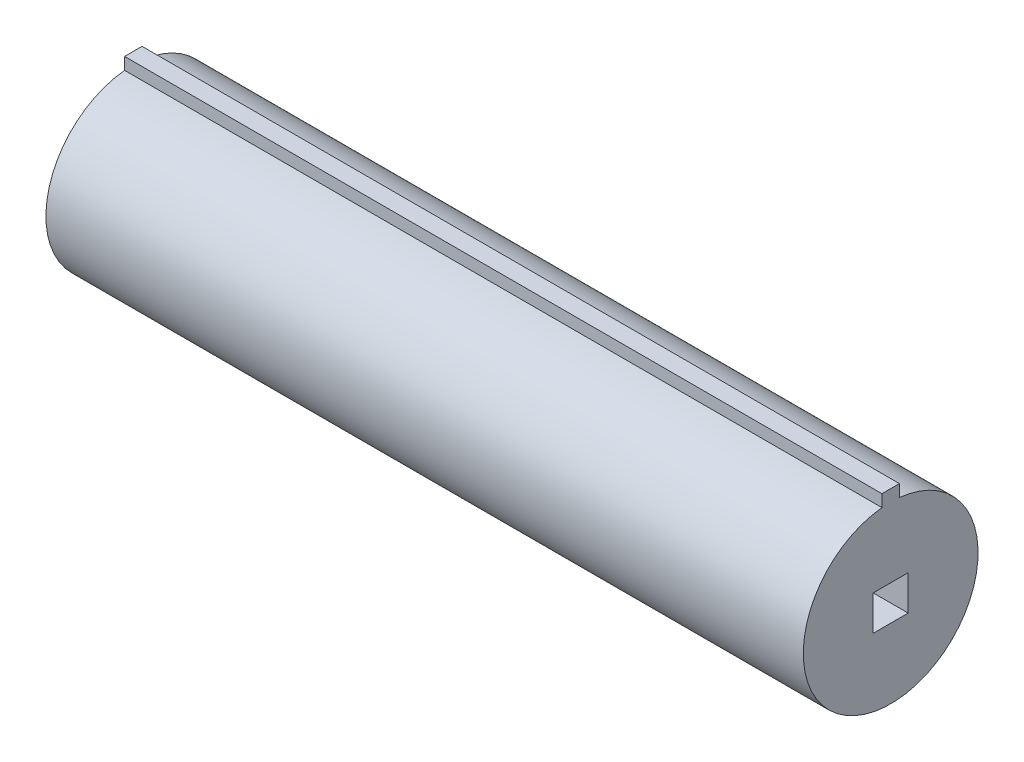
ISO-10303-21;
HEADER;
FILE_DESCRIPTION(('STEP AP214'),'2;1');
FILE_NAME('part.step','',(''),(''),'','','');
FILE_SCHEMA(('AUTOMOTIVE_DESIGN { 1 0 10303 214 1 1 1 1 }'));
ENDSEC;
DATA;
#1=APPLICATION_CONTEXT('core data for automotive mechanical design processes');
#2=APPLICATION_PROTOCOL_DEFINITION('international standard','automotive_design',2000,#1);
#3=PRODUCT_CONTEXT('',#1,'mechanical');
#4=PRODUCT('Part','Part','',(#3));
#5=PRODUCT_RELATED_PRODUCT_CATEGORY('part','',(#4));
#6=PRODUCT_DEFINITION_FORMATION('','',#4);
#7=PRODUCT_DEFINITION_CONTEXT('part definition',#1,'design');
#8=PRODUCT_DEFINITION('design','',#6,#7);
#9=PRODUCT_DEFINITION_SHAPE('','',#8);
#10=(LENGTH_UNIT() NAMED_UNIT(*) SI_UNIT(.MILLI.,.METRE.));
#11=(NAMED_UNIT(*) PLANE_ANGLE_UNIT() SI_UNIT($,.RADIAN.));
#12=(NAMED_UNIT(*) SI_UNIT($,.STERADIAN.) SOLID_ANGLE_UNIT());
#13=UNCERTAINTY_MEASURE_WITH_UNIT(LENGTH_MEASURE(1.E-05),#10,'distance_accuracy_value','');
#14=(GEOMETRIC_REPRESENTATION_CONTEXT(3) GLOBAL_UNCERTAINTY_ASSIGNED_CONTEXT((#13)) GLOBAL_UNIT_ASSIGNED_CONTEXT((#10,
#11,#12)) REPRESENTATION_CONTEXT('',''));
#15=CARTESIAN_POINT('',(0.,0.,0.));
#16=DIRECTION('',(0.,0.,1.));
#17=DIRECTION('',(1.,0.,0.));
#18=AXIS2_PLACEMENT_3D('',#15,#16,#17);
#19=CARTESIAN_POINT('',(130.,0.,0.));
#20=DIRECTION('',(-1.,0.,0.));
#21=DIRECTION('',(0.,0.,1.));
#22=AXIS2_PLACEMENT_3D('',#19,#20,#21);
#23=CYLINDRICAL_SURFACE('',#22,15.);
#24=CARTESIAN_POINT('',(0.,0.,0.));
#25=DIRECTION('',(1.,0.,0.));
#26=DIRECTION('',(0.,0.,-1.));
#27=AXIS2_PLACEMENT_3D('',#24,#25,#26);
#28=CIRCLE('',#27,15.);
#29=CARTESIAN_POINT('',(0.,14.9248115565993,1.5));
#30=VERTEX_POINT('',#29);
#31=CARTESIAN_POINT('',(0.,14.9248115565993,-1.5));
#32=VERTEX_POINT('',#31);
#33=EDGE_CURVE('E164',#30,#32,#28,.T.);
#34=ORIENTED_EDGE('',*,*,#33,.T.);
#35=DIRECTION('',(-1.,0.,0.));
#36=VECTOR('',#35,1.);
#37=CARTESIAN_POINT('',(130.,14.9248115565993,-1.5));
#38=LINE('',#37,#36);
#39=CARTESIAN_POINT('',(130.,14.9248115565993,-1.5));
#40=VERTEX_POINT('',#39);
#41=EDGE_CURVE('E11',#40,#32,#38,.T.);
#42=ORIENTED_EDGE('',*,*,#41,.F.);
#43=CARTESIAN_POINT('',(130.,0.,0.));
#44=DIRECTION('',(1.,0.,0.));
#45=DIRECTION('',(0.,0.,-1.));
#46=AXIS2_PLACEMENT_3D('',#43,#44,#45);
#47=CIRCLE('',#46,15.);
#48=CARTESIAN_POINT('',(130.,14.9248115565993,1.5));
#49=VERTEX_POINT('',#48);
#50=EDGE_CURVE('E170',#49,#40,#47,.T.);
#51=ORIENTED_EDGE('',*,*,#50,.F.);
#52=DIRECTION('',(-1.,0.,0.));
#53=VECTOR('',#52,1.);
#54=CARTESIAN_POINT('',(130.,14.9248115565993,1.5));
#55=LINE('',#54,#53);
#56=EDGE_CURVE('E70',#49,#30,#55,.T.);
#57=ORIENTED_EDGE('',*,*,#56,.T.);
#58=EDGE_LOOP('',(#34,#42,#51,#57));
#59=FACE_BOUND('',#58,.T.);
#60=ADVANCED_FACE('F46',(#59),#23,.T.);
#61=CARTESIAN_POINT('',(130.,0.,-1.5));
#62=DIRECTION('',(0.,0.,1.));
#63=DIRECTION('',(0.,-1.,0.));
#64=AXIS2_PLACEMENT_3D('',#61,#62,#63);
#65=PLANE('',#64);
#66=DIRECTION('',(0.,1.,0.));
#67=VECTOR('',#66,1.);
#68=CARTESIAN_POINT('',(0.,0.,-1.5));
#69=LINE('',#68,#67);
#70=CARTESIAN_POINT('',(0.,17.,-1.5));
#71=VERTEX_POINT('',#70);
#72=EDGE_CURVE('E185',#32,#71,#69,.T.);
#73=ORIENTED_EDGE('',*,*,#72,.T.);
#74=DIRECTION('',(-1.,0.,0.));
#75=VECTOR('',#74,1.);
#76=CARTESIAN_POINT('',(130.,17.,-1.5));
#77=LINE('',#76,#75);
#78=CARTESIAN_POINT('',(130.,17.,-1.5));
#79=VERTEX_POINT('',#78);
#80=EDGE_CURVE('E54',#79,#71,#77,.T.);
#81=ORIENTED_EDGE('',*,*,#80,.F.);
#82=DIRECTION('',(0.,1.,0.));
#83=VECTOR('',#82,1.);
#84=CARTESIAN_POINT('',(130.,0.,-1.5));
#85=LINE('',#84,#83);
#86=EDGE_CURVE('E96',#40,#79,#85,.T.);
#87=ORIENTED_EDGE('',*,*,#86,.F.);
#88=ORIENTED_EDGE('',*,*,#41,.T.);
#89=EDGE_LOOP('',(#73,#81,#87,#88));
#90=FACE_BOUND('',#89,.T.);
#91=ADVANCED_FACE('F205',(#90),#65,.F.);
#92=CARTESIAN_POINT('',(130.,17.,0.));
#93=DIRECTION('',(0.,1.,0.));
#94=DIRECTION('',(0.,0.,1.));
#95=AXIS2_PLACEMENT_3D('',#92,#93,#94);
#96=PLANE('',#95);
#97=DIRECTION('',(0.,0.,-1.));
#98=VECTOR('',#97,1.);
#99=CARTESIAN_POINT('',(0.,17.,0.));
#100=LINE('',#99,#98);
#101=CARTESIAN_POINT('',(0.,17.,1.5));
#102=VERTEX_POINT('',#101);
#103=EDGE_CURVE('E189',#102,#71,#100,.T.);
#104=ORIENTED_EDGE('',*,*,#103,.F.);
#105=DIRECTION('',(-1.,0.,0.));
#106=VECTOR('',#105,1.);
#107=CARTESIAN_POINT('',(130.,17.,1.5));
#108=LINE('',#107,#106);
#109=CARTESIAN_POINT('',(130.,17.,1.5));
#110=VERTEX_POINT('',#109);
#111=EDGE_CURVE('E198',#110,#102,#108,.T.);
#112=ORIENTED_EDGE('',*,*,#111,.F.);
#113=DIRECTION('',(0.,0.,-1.));
#114=VECTOR('',#113,1.);
#115=CARTESIAN_POINT('',(130.,17.,0.));
#116=LINE('',#115,#114);
#117=EDGE_CURVE('E176',#110,#79,#116,.T.);
#118=ORIENTED_EDGE('',*,*,#117,.T.);
#119=ORIENTED_EDGE('',*,*,#80,.T.);
#120=EDGE_LOOP('',(#104,#112,#118,#119));
#121=FACE_BOUND('',#120,.T.);
#122=ADVANCED_FACE('F203',(#121),#96,.T.);
#123=CARTESIAN_POINT('',(130.,0.,1.5));
#124=DIRECTION('',(0.,0.,1.));
#125=DIRECTION('',(1.,0.,0.));
#126=AXIS2_PLACEMENT_3D('',#123,#124,#125);
#127=PLANE('',#126);
#128=DIRECTION('',(0.,1.,0.));
#129=VECTOR('',#128,1.);
#130=CARTESIAN_POINT('',(0.,0.,1.5));
#131=LINE('',#130,#129);
#132=EDGE_CURVE('E173',#30,#102,#131,.T.);
#133=ORIENTED_EDGE('',*,*,#132,.F.);
#134=ORIENTED_EDGE('',*,*,#56,.F.);
#135=DIRECTION('',(0.,1.,0.));
#136=VECTOR('',#135,1.);
#137=CARTESIAN_POINT('',(130.,0.,1.5));
#138=LINE('',#137,#136);
#139=EDGE_CURVE('E180',#49,#110,#138,.T.);
#140=ORIENTED_EDGE('',*,*,#139,.T.);
#141=ORIENTED_EDGE('',*,*,#111,.T.);
#142=EDGE_LOOP('',(#133,#134,#140,#141));
#143=FACE_BOUND('',#142,.T.);
#144=ADVANCED_FACE('F209',(#143),#127,.T.);
#145=CARTESIAN_POINT('',(130.,0.,0.));
#146=DIRECTION('',(1.,0.,0.));
#147=DIRECTION('',(0.,0.,-1.));
#148=AXIS2_PLACEMENT_3D('',#145,#146,#147);
#149=PLANE('',#148);
#150=DIRECTION('',(0.,1.,0.));
#151=VECTOR('',#150,1.);
#152=CARTESIAN_POINT('',(130.,-3.,-3.));
#153=LINE('',#152,#151);
#154=CARTESIAN_POINT('',(130.,-3.,-3.));
#155=VERTEX_POINT('',#154);
#156=CARTESIAN_POINT('',(130.,3.,-3.));
#157=VERTEX_POINT('',#156);
#158=EDGE_CURVE('E61',#155,#157,#153,.T.);
#159=ORIENTED_EDGE('',*,*,#158,.F.);
#160=DIRECTION('',(0.,0.,-1.));
#161=VECTOR('',#160,1.);
#162=CARTESIAN_POINT('',(130.,-3.,3.));
#163=LINE('',#162,#161);
#164=CARTESIAN_POINT('',(130.,-3.,3.));
#165=VERTEX_POINT('',#164);
#166=EDGE_CURVE('E142',#165,#155,#163,.T.);
#167=ORIENTED_EDGE('',*,*,#166,.F.);
#168=DIRECTION('',(0.,-1.,0.));
#169=VECTOR('',#168,1.);
#170=CARTESIAN_POINT('',(130.,-3.,3.));
#171=LINE('',#170,#169);
#172=CARTESIAN_POINT('',(130.,3.,3.));
#173=VERTEX_POINT('',#172);
#174=EDGE_CURVE('E146',#173,#165,#171,.T.);
#175=ORIENTED_EDGE('',*,*,#174,.F.);
#176=DIRECTION('',(0.,0.,1.));
#177=VECTOR('',#176,1.);
#178=CARTESIAN_POINT('',(130.,3.,3.));
#179=LINE('',#178,#177);
#180=EDGE_CURVE('E155',#157,#173,#179,.T.);
#181=ORIENTED_EDGE('',*,*,#180,.F.);
#182=EDGE_LOOP('',(#159,#167,#175,#181));
#183=FACE_BOUND('',#182,.T.);
#184=ORIENTED_EDGE('',*,*,#50,.T.);
#185=ORIENTED_EDGE('',*,*,#86,.T.);
#186=ORIENTED_EDGE('',*,*,#117,.F.);
#187=ORIENTED_EDGE('',*,*,#139,.F.);
#188=EDGE_LOOP('',(#184,#185,#186,#187));
#189=FACE_BOUND('',#188,.T.);
#190=ADVANCED_FACE('F212',(#183,#189),#149,.T.);
#191=CARTESIAN_POINT('',(0.,0.,0.));
#192=DIRECTION('',(1.,0.,0.));
#193=DIRECTION('',(0.,0.,-1.));
#194=AXIS2_PLACEMENT_3D('',#191,#192,#193);
#195=PLANE('',#194);
#196=ORIENTED_EDGE('',*,*,#33,.F.);
#197=ORIENTED_EDGE('',*,*,#132,.T.);
#198=ORIENTED_EDGE('',*,*,#103,.T.);
#199=ORIENTED_EDGE('',*,*,#72,.F.);
#200=EDGE_LOOP('',(#196,#197,#198,#199));
#201=FACE_BOUND('',#200,.T.);
#202=ADVANCED_FACE('F208',(#201),#195,.F.);
#203=CARTESIAN_POINT('',(115.,-3.,-3.));
#204=DIRECTION('',(0.,0.,-1.));
#205=DIRECTION('',(-1.,0.,0.));
#206=AXIS2_PLACEMENT_3D('',#203,#204,#205);
#207=PLANE('',#206);
#208=ORIENTED_EDGE('',*,*,#158,.T.);
#209=DIRECTION('',(1.,0.,0.));
#210=VECTOR('',#209,1.);
#211=CARTESIAN_POINT('',(115.,3.,-3.));
#212=LINE('',#211,#210);
#213=CARTESIAN_POINT('',(115.,3.,-3.));
#214=VERTEX_POINT('',#213);
#215=EDGE_CURVE('E117',#214,#157,#212,.T.);
#216=ORIENTED_EDGE('',*,*,#215,.F.);
#217=DIRECTION('',(0.,1.,0.));
#218=VECTOR('',#217,1.);
#219=CARTESIAN_POINT('',(115.,-3.,-3.));
#220=LINE('',#219,#218);
#221=CARTESIAN_POINT('',(115.,-3.,-3.));
#222=VERTEX_POINT('',#221);
#223=EDGE_CURVE('E121',#222,#214,#220,.T.);
#224=ORIENTED_EDGE('',*,*,#223,.F.);
#225=DIRECTION('',(1.,0.,0.));
#226=VECTOR('',#225,1.);
#227=CARTESIAN_POINT('',(115.,-3.,-3.));
#228=LINE('',#227,#226);
#229=EDGE_CURVE('E161',#222,#155,#228,.T.);
#230=ORIENTED_EDGE('',*,*,#229,.T.);
#231=EDGE_LOOP('',(#208,#216,#224,#230));
#232=FACE_BOUND('',#231,.T.);
#233=ADVANCED_FACE('F119',(#232),#207,.F.);
#234=CARTESIAN_POINT('',(115.,-3.,3.));
#235=DIRECTION('',(0.,-1.,0.));
#236=DIRECTION('',(0.,0.,-1.));
#237=AXIS2_PLACEMENT_3D('',#234,#235,#236);
#238=PLANE('',#237);
#239=ORIENTED_EDGE('',*,*,#166,.T.);
#240=ORIENTED_EDGE('',*,*,#229,.F.);
#241=DIRECTION('',(0.,0.,-1.));
#242=VECTOR('',#241,1.);
#243=CARTESIAN_POINT('',(115.,-3.,3.));
#244=LINE('',#243,#242);
#245=CARTESIAN_POINT('',(115.,-3.,3.));
#246=VERTEX_POINT('',#245);
#247=EDGE_CURVE('E128',#246,#222,#244,.T.);
#248=ORIENTED_EDGE('',*,*,#247,.F.);
#249=DIRECTION('',(1.,0.,0.));
#250=VECTOR('',#249,1.);
#251=CARTESIAN_POINT('',(115.,-3.,3.));
#252=LINE('',#251,#250);
#253=EDGE_CURVE('E165',#246,#165,#252,.T.);
#254=ORIENTED_EDGE('',*,*,#253,.T.);
#255=EDGE_LOOP('',(#239,#240,#248,#254));
#256=FACE_BOUND('',#255,.T.);
#257=ADVANCED_FACE('F231',(#256),#238,.F.);
#258=CARTESIAN_POINT('',(115.,-3.,3.));
#259=DIRECTION('',(0.,0.,1.));
#260=DIRECTION('',(1.,0.,0.));
#261=AXIS2_PLACEMENT_3D('',#258,#259,#260);
#262=PLANE('',#261);
#263=ORIENTED_EDGE('',*,*,#174,.T.);
#264=ORIENTED_EDGE('',*,*,#253,.F.);
#265=DIRECTION('',(0.,-1.,0.));
#266=VECTOR('',#265,1.);
#267=CARTESIAN_POINT('',(115.,-3.,3.));
#268=LINE('',#267,#266);
#269=CARTESIAN_POINT('',(115.,3.,3.));
#270=VERTEX_POINT('',#269);
#271=EDGE_CURVE('E137',#270,#246,#268,.T.);
#272=ORIENTED_EDGE('',*,*,#271,.F.);
#273=DIRECTION('',(1.,0.,0.));
#274=VECTOR('',#273,1.);
#275=CARTESIAN_POINT('',(115.,3.,3.));
#276=LINE('',#275,#274);
#277=EDGE_CURVE('E127',#270,#173,#276,.T.);
#278=ORIENTED_EDGE('',*,*,#277,.T.);
#279=EDGE_LOOP('',(#263,#264,#272,#278));
#280=FACE_BOUND('',#279,.T.);
#281=ADVANCED_FACE('F234',(#280),#262,.F.);
#282=CARTESIAN_POINT('',(115.,3.,3.));
#283=DIRECTION('',(0.,1.,0.));
#284=DIRECTION('',(0.,0.,1.));
#285=AXIS2_PLACEMENT_3D('',#282,#283,#284);
#286=PLANE('',#285);
#287=ORIENTED_EDGE('',*,*,#180,.T.);
#288=ORIENTED_EDGE('',*,*,#277,.F.);
#289=DIRECTION('',(0.,0.,1.));
#290=VECTOR('',#289,1.);
#291=CARTESIAN_POINT('',(115.,3.,3.));
#292=LINE('',#291,#290);
#293=EDGE_CURVE('E131',#214,#270,#292,.T.);
#294=ORIENTED_EDGE('',*,*,#293,.F.);
#295=ORIENTED_EDGE('',*,*,#215,.T.);
#296=EDGE_LOOP('',(#287,#288,#294,#295));
#297=FACE_BOUND('',#296,.T.);
#298=ADVANCED_FACE('F132',(#297),#286,.F.);
#299=CARTESIAN_POINT('',(115.,0.,0.));
#300=DIRECTION('',(-1.,0.,0.));
#301=DIRECTION('',(0.,0.,1.));
#302=AXIS2_PLACEMENT_3D('',#299,#300,#301);
#303=PLANE('',#302);
#304=ORIENTED_EDGE('',*,*,#223,.T.);
#305=ORIENTED_EDGE('',*,*,#293,.T.);
#306=ORIENTED_EDGE('',*,*,#271,.T.);
#307=ORIENTED_EDGE('',*,*,#247,.T.);
#308=EDGE_LOOP('',(#304,#305,#306,#307));
#309=FACE_BOUND('',#308,.T.);
#310=ADVANCED_FACE('F139',(#309),#303,.F.);
#311=CLOSED_SHELL('',(#60,#91,#122,#144,#190,#202,#233,#257,#281,#298,#310));
#312=MANIFOLD_SOLID_BREP('B2',#311);
#313=ADVANCED_BREP_SHAPE_REPRESENTATION('',(#18,#312),#14);
#314=SHAPE_DEFINITION_REPRESENTATION(#9,#313);
ENDSEC;
END-ISO-10303-21;
